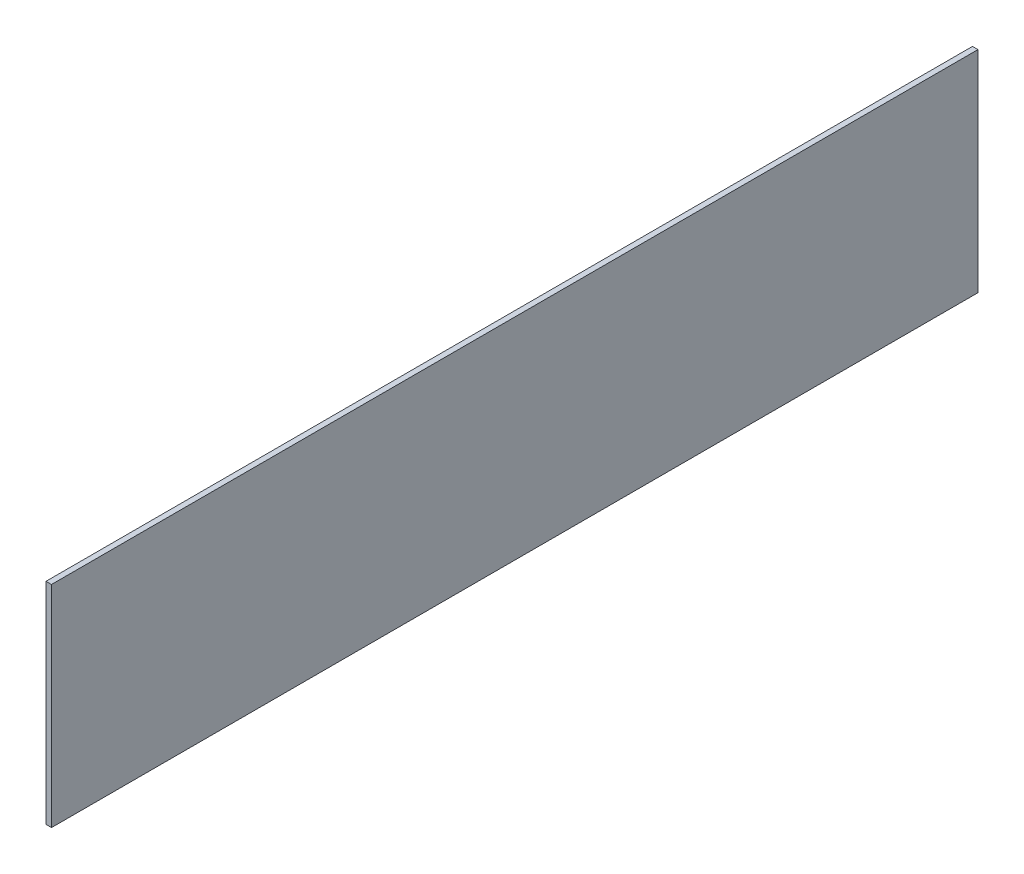
ISO-10303-21;
HEADER;
FILE_DESCRIPTION(('STEP AP214'),'2;1');
FILE_NAME('part.step','',(''),(''),'','','');
FILE_SCHEMA(('AUTOMOTIVE_DESIGN { 1 0 10303 214 1 1 1 1 }'));
ENDSEC;
DATA;
#1=APPLICATION_CONTEXT('core data for automotive mechanical design processes');
#2=APPLICATION_PROTOCOL_DEFINITION('international standard','automotive_design',2000,#1);
#3=PRODUCT_CONTEXT('',#1,'mechanical');
#4=PRODUCT('Part','Part','',(#3));
#5=PRODUCT_RELATED_PRODUCT_CATEGORY('part','',(#4));
#6=PRODUCT_DEFINITION_FORMATION('','',#4);
#7=PRODUCT_DEFINITION_CONTEXT('part definition',#1,'design');
#8=PRODUCT_DEFINITION('design','',#6,#7);
#9=PRODUCT_DEFINITION_SHAPE('','',#8);
#10=(LENGTH_UNIT() NAMED_UNIT(*) SI_UNIT(.MILLI.,.METRE.));
#11=(NAMED_UNIT(*) PLANE_ANGLE_UNIT() SI_UNIT($,.RADIAN.));
#12=(NAMED_UNIT(*) SI_UNIT($,.STERADIAN.) SOLID_ANGLE_UNIT());
#13=UNCERTAINTY_MEASURE_WITH_UNIT(LENGTH_MEASURE(1.E-05),#10,'distance_accuracy_value','');
#14=(GEOMETRIC_REPRESENTATION_CONTEXT(3) GLOBAL_UNCERTAINTY_ASSIGNED_CONTEXT((#13)) GLOBAL_UNIT_ASSIGNED_CONTEXT((#10,
#11,#12)) REPRESENTATION_CONTEXT('',''));
#15=CARTESIAN_POINT('',(0.,0.,0.));
#16=DIRECTION('',(0.,0.,1.));
#17=DIRECTION('',(1.,0.,0.));
#18=AXIS2_PLACEMENT_3D('',#15,#16,#17);
#19=CARTESIAN_POINT('',(-3.,57.5,-253.));
#20=DIRECTION('',(0.,0.,-1.));
#21=DIRECTION('',(-1.,0.,0.));
#22=AXIS2_PLACEMENT_3D('',#19,#20,#21);
#23=PLANE('',#22);
#24=DIRECTION('',(0.,1.,0.));
#25=VECTOR('',#24,1.);
#26=CARTESIAN_POINT('',(0.,57.5,-253.));
#27=LINE('',#26,#25);
#28=CARTESIAN_POINT('',(0.,-57.5,-253.));
#29=VERTEX_POINT('',#28);
#30=CARTESIAN_POINT('',(0.,57.5,-253.));
#31=VERTEX_POINT('',#30);
#32=EDGE_CURVE('E115',#29,#31,#27,.T.);
#33=ORIENTED_EDGE('',*,*,#32,.F.);
#34=DIRECTION('',(1.,0.,0.));
#35=VECTOR('',#34,1.);
#36=CARTESIAN_POINT('',(-3.,-57.5,-253.));
#37=LINE('',#36,#35);
#38=CARTESIAN_POINT('',(-3.,-57.5,-253.));
#39=VERTEX_POINT('',#38);
#40=EDGE_CURVE('E11',#39,#29,#37,.T.);
#41=ORIENTED_EDGE('',*,*,#40,.F.);
#42=DIRECTION('',(0.,1.,0.));
#43=VECTOR('',#42,1.);
#44=CARTESIAN_POINT('',(-3.,57.5,-253.));
#45=LINE('',#44,#43);
#46=CARTESIAN_POINT('',(-3.,57.5,-253.));
#47=VERTEX_POINT('',#46);
#48=EDGE_CURVE('E106',#39,#47,#45,.T.);
#49=ORIENTED_EDGE('',*,*,#48,.T.);
#50=DIRECTION('',(1.,0.,0.));
#51=VECTOR('',#50,1.);
#52=CARTESIAN_POINT('',(-3.,57.5,-253.));
#53=LINE('',#52,#51);
#54=EDGE_CURVE('E47',#47,#31,#53,.T.);
#55=ORIENTED_EDGE('',*,*,#54,.T.);
#56=EDGE_LOOP('',(#33,#41,#49,#55));
#57=FACE_BOUND('',#56,.T.);
#58=ADVANCED_FACE('F44',(#57),#23,.T.);
#59=CARTESIAN_POINT('',(-3.,-57.5,253.));
#60=DIRECTION('',(0.,-1.,0.));
#61=DIRECTION('',(0.,0.,-1.));
#62=AXIS2_PLACEMENT_3D('',#59,#60,#61);
#63=PLANE('',#62);
#64=DIRECTION('',(0.,0.,-1.));
#65=VECTOR('',#64,1.);
#66=CARTESIAN_POINT('',(0.,-57.5,253.));
#67=LINE('',#66,#65);
#68=CARTESIAN_POINT('',(0.,-57.5,253.));
#69=VERTEX_POINT('',#68);
#70=EDGE_CURVE('E110',#69,#29,#67,.T.);
#71=ORIENTED_EDGE('',*,*,#70,.F.);
#72=DIRECTION('',(1.,0.,0.));
#73=VECTOR('',#72,1.);
#74=CARTESIAN_POINT('',(-3.,-57.5,253.));
#75=LINE('',#74,#73);
#76=CARTESIAN_POINT('',(-3.,-57.5,253.));
#77=VERTEX_POINT('',#76);
#78=EDGE_CURVE('E54',#77,#69,#75,.T.);
#79=ORIENTED_EDGE('',*,*,#78,.F.);
#80=DIRECTION('',(0.,0.,-1.));
#81=VECTOR('',#80,1.);
#82=CARTESIAN_POINT('',(-3.,-57.5,253.));
#83=LINE('',#82,#81);
#84=EDGE_CURVE('E101',#77,#39,#83,.T.);
#85=ORIENTED_EDGE('',*,*,#84,.T.);
#86=ORIENTED_EDGE('',*,*,#40,.T.);
#87=EDGE_LOOP('',(#71,#79,#85,#86));
#88=FACE_BOUND('',#87,.T.);
#89=ADVANCED_FACE('F137',(#88),#63,.T.);
#90=CARTESIAN_POINT('',(-3.,57.5,253.));
#91=DIRECTION('',(0.,0.,1.));
#92=DIRECTION('',(0.,-1.,0.));
#93=AXIS2_PLACEMENT_3D('',#90,#91,#92);
#94=PLANE('',#93);
#95=DIRECTION('',(0.,-1.,0.));
#96=VECTOR('',#95,1.);
#97=CARTESIAN_POINT('',(0.,57.5,253.));
#98=LINE('',#97,#96);
#99=CARTESIAN_POINT('',(0.,57.5,253.));
#100=VERTEX_POINT('',#99);
#101=EDGE_CURVE('E95',#100,#69,#98,.T.);
#102=ORIENTED_EDGE('',*,*,#101,.F.);
#103=DIRECTION('',(1.,0.,0.));
#104=VECTOR('',#103,1.);
#105=CARTESIAN_POINT('',(-3.,57.5,253.));
#106=LINE('',#105,#104);
#107=CARTESIAN_POINT('',(-3.,57.5,253.));
#108=VERTEX_POINT('',#107);
#109=EDGE_CURVE('E90',#108,#100,#106,.T.);
#110=ORIENTED_EDGE('',*,*,#109,.F.);
#111=DIRECTION('',(0.,-1.,0.));
#112=VECTOR('',#111,1.);
#113=CARTESIAN_POINT('',(-3.,57.5,253.));
#114=LINE('',#113,#112);
#115=EDGE_CURVE('E93',#108,#77,#114,.T.);
#116=ORIENTED_EDGE('',*,*,#115,.T.);
#117=ORIENTED_EDGE('',*,*,#78,.T.);
#118=EDGE_LOOP('',(#102,#110,#116,#117));
#119=FACE_BOUND('',#118,.T.);
#120=ADVANCED_FACE('F92',(#119),#94,.T.);
#121=CARTESIAN_POINT('',(-3.,57.5,253.));
#122=DIRECTION('',(0.,1.,0.));
#123=DIRECTION('',(0.,0.,1.));
#124=AXIS2_PLACEMENT_3D('',#121,#122,#123);
#125=PLANE('',#124);
#126=DIRECTION('',(0.,0.,1.));
#127=VECTOR('',#126,1.);
#128=CARTESIAN_POINT('',(0.,57.5,253.));
#129=LINE('',#128,#127);
#130=EDGE_CURVE('E119',#31,#100,#129,.T.);
#131=ORIENTED_EDGE('',*,*,#130,.F.);
#132=ORIENTED_EDGE('',*,*,#54,.F.);
#133=DIRECTION('',(0.,0.,1.));
#134=VECTOR('',#133,1.);
#135=CARTESIAN_POINT('',(-3.,57.5,253.));
#136=LINE('',#135,#134);
#137=EDGE_CURVE('E100',#47,#108,#136,.T.);
#138=ORIENTED_EDGE('',*,*,#137,.T.);
#139=ORIENTED_EDGE('',*,*,#109,.T.);
#140=EDGE_LOOP('',(#131,#132,#138,#139));
#141=FACE_BOUND('',#140,.T.);
#142=ADVANCED_FACE('F104',(#141),#125,.T.);
#143=CARTESIAN_POINT('',(-3.,0.,0.));
#144=DIRECTION('',(1.,0.,0.));
#145=DIRECTION('',(0.,0.,-1.));
#146=AXIS2_PLACEMENT_3D('',#143,#144,#145);
#147=PLANE('',#146);
#148=ORIENTED_EDGE('',*,*,#48,.F.);
#149=ORIENTED_EDGE('',*,*,#84,.F.);
#150=ORIENTED_EDGE('',*,*,#115,.F.);
#151=ORIENTED_EDGE('',*,*,#137,.F.);
#152=EDGE_LOOP('',(#148,#149,#150,#151));
#153=FACE_BOUND('',#152,.T.);
#154=ADVANCED_FACE('F99',(#153),#147,.F.);
#155=CARTESIAN_POINT('',(0.,0.,0.));
#156=DIRECTION('',(1.,0.,0.));
#157=DIRECTION('',(0.,0.,-1.));
#158=AXIS2_PLACEMENT_3D('',#155,#156,#157);
#159=PLANE('',#158);
#160=ORIENTED_EDGE('',*,*,#32,.T.);
#161=ORIENTED_EDGE('',*,*,#130,.T.);
#162=ORIENTED_EDGE('',*,*,#101,.T.);
#163=ORIENTED_EDGE('',*,*,#70,.T.);
#164=EDGE_LOOP('',(#160,#161,#162,#163));
#165=FACE_BOUND('',#164,.T.);
#166=ADVANCED_FACE('F136',(#165),#159,.T.);
#167=CLOSED_SHELL('',(#58,#89,#120,#142,#154,#166));
#168=MANIFOLD_SOLID_BREP('B2',#167);
#169=ADVANCED_BREP_SHAPE_REPRESENTATION('',(#18,#168),#14);
#170=SHAPE_DEFINITION_REPRESENTATION(#9,#169);
ENDSEC;
END-ISO-10303-21;
